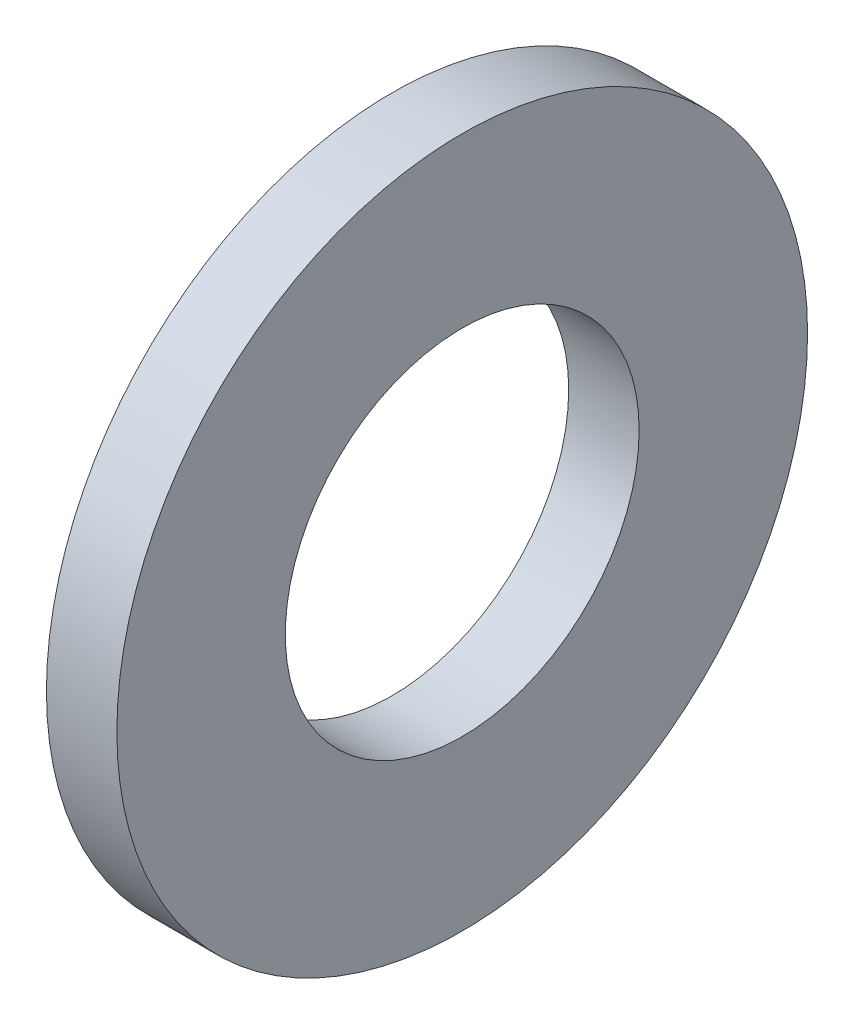
ISO-10303-21;
HEADER;
FILE_DESCRIPTION(('STEP AP214'),'2;1');
FILE_NAME('part.step','',(''),(''),'','','');
FILE_SCHEMA(('AUTOMOTIVE_DESIGN { 1 0 10303 214 1 1 1 1 }'));
ENDSEC;
DATA;
#1=APPLICATION_CONTEXT('core data for automotive mechanical design processes');
#2=APPLICATION_PROTOCOL_DEFINITION('international standard','automotive_design',2000,#1);
#3=PRODUCT_CONTEXT('',#1,'mechanical');
#4=PRODUCT('Part','Part','',(#3));
#5=PRODUCT_RELATED_PRODUCT_CATEGORY('part','',(#4));
#6=PRODUCT_DEFINITION_FORMATION('','',#4);
#7=PRODUCT_DEFINITION_CONTEXT('part definition',#1,'design');
#8=PRODUCT_DEFINITION('design','',#6,#7);
#9=PRODUCT_DEFINITION_SHAPE('','',#8);
#10=(LENGTH_UNIT() NAMED_UNIT(*) SI_UNIT(.MILLI.,.METRE.));
#11=(NAMED_UNIT(*) PLANE_ANGLE_UNIT() SI_UNIT($,.RADIAN.));
#12=(NAMED_UNIT(*) SI_UNIT($,.STERADIAN.) SOLID_ANGLE_UNIT());
#13=UNCERTAINTY_MEASURE_WITH_UNIT(LENGTH_MEASURE(1.E-05),#10,'distance_accuracy_value','');
#14=(GEOMETRIC_REPRESENTATION_CONTEXT(3) GLOBAL_UNCERTAINTY_ASSIGNED_CONTEXT((#13)) GLOBAL_UNIT_ASSIGNED_CONTEXT((#10,
#11,#12)) REPRESENTATION_CONTEXT('',''));
#15=CARTESIAN_POINT('',(0.,0.,0.));
#16=DIRECTION('',(0.,0.,1.));
#17=DIRECTION('',(1.,0.,0.));
#18=AXIS2_PLACEMENT_3D('',#15,#16,#17);
#19=CARTESIAN_POINT('',(1.2,0.,0.));
#20=DIRECTION('',(1.,0.,0.));
#21=DIRECTION('',(0.,0.,-1.));
#22=AXIS2_PLACEMENT_3D('',#19,#20,#21);
#23=PLANE('',#22);
#24=CARTESIAN_POINT('',(1.2,0.,0.));
#25=DIRECTION('',(1.,0.,0.));
#26=DIRECTION('',(0.,0.,-1.));
#27=AXIS2_PLACEMENT_3D('',#24,#25,#26);
#28=CIRCLE('',#27,5.885);
#29=CARTESIAN_POINT('',(1.2,0.,-5.885));
#30=VERTEX_POINT('',#29);
#31=EDGE_CURVE('E10',#30,#30,#28,.T.);
#32=ORIENTED_EDGE('',*,*,#31,.T.);
#33=EDGE_LOOP('',(#32));
#34=FACE_BOUND('',#33,.T.);
#35=CARTESIAN_POINT('',(1.2,0.,0.));
#36=DIRECTION('',(1.,0.,0.));
#37=DIRECTION('',(0.,0.,-1.));
#38=AXIS2_PLACEMENT_3D('',#35,#36,#37);
#39=CIRCLE('',#38,3.015);
#40=CARTESIAN_POINT('',(1.2,0.,-3.015));
#41=VERTEX_POINT('',#40);
#42=EDGE_CURVE('E41',#41,#41,#39,.T.);
#43=ORIENTED_EDGE('',*,*,#42,.F.);
#44=EDGE_LOOP('',(#43));
#45=FACE_BOUND('',#44,.T.);
#46=ADVANCED_FACE('F30',(#34,#45),#23,.T.);
#47=CARTESIAN_POINT('',(0.,0.,0.));
#48=DIRECTION('',(1.,0.,0.));
#49=DIRECTION('',(0.,0.,-1.));
#50=AXIS2_PLACEMENT_3D('',#47,#48,#49);
#51=PLANE('',#50);
#52=CARTESIAN_POINT('',(0.,0.,0.));
#53=DIRECTION('',(1.,0.,0.));
#54=DIRECTION('',(0.,0.,-1.));
#55=AXIS2_PLACEMENT_3D('',#52,#53,#54);
#56=CIRCLE('',#55,5.885);
#57=CARTESIAN_POINT('',(0.,0.,-5.885));
#58=VERTEX_POINT('',#57);
#59=EDGE_CURVE('E34',#58,#58,#56,.T.);
#60=ORIENTED_EDGE('',*,*,#59,.F.);
#61=EDGE_LOOP('',(#60));
#62=FACE_BOUND('',#61,.T.);
#63=CARTESIAN_POINT('',(0.,0.,0.));
#64=DIRECTION('',(1.,0.,0.));
#65=DIRECTION('',(0.,0.,-1.));
#66=AXIS2_PLACEMENT_3D('',#63,#64,#65);
#67=CIRCLE('',#66,3.015);
#68=CARTESIAN_POINT('',(0.,0.,-3.015));
#69=VERTEX_POINT('',#68);
#70=EDGE_CURVE('E43',#69,#69,#67,.T.);
#71=ORIENTED_EDGE('',*,*,#70,.T.);
#72=EDGE_LOOP('',(#71));
#73=FACE_BOUND('',#72,.T.);
#74=ADVANCED_FACE('F53',(#62,#73),#51,.F.);
#75=CARTESIAN_POINT('',(1.2,0.,0.));
#76=DIRECTION('',(-1.,0.,0.));
#77=DIRECTION('',(0.,0.,1.));
#78=AXIS2_PLACEMENT_3D('',#75,#76,#77);
#79=CYLINDRICAL_SURFACE('',#78,5.885);
#80=ORIENTED_EDGE('',*,*,#31,.F.);
#81=EDGE_LOOP('',(#80));
#82=FACE_BOUND('',#81,.T.);
#83=ORIENTED_EDGE('',*,*,#59,.T.);
#84=EDGE_LOOP('',(#83));
#85=FACE_BOUND('',#84,.T.);
#86=ADVANCED_FACE('F32',(#82,#85),#79,.T.);
#87=CARTESIAN_POINT('',(1.2,0.,0.));
#88=DIRECTION('',(-1.,0.,0.));
#89=DIRECTION('',(0.,0.,1.));
#90=AXIS2_PLACEMENT_3D('',#87,#88,#89);
#91=CYLINDRICAL_SURFACE('',#90,3.015);
#92=ORIENTED_EDGE('',*,*,#42,.T.);
#93=EDGE_LOOP('',(#92));
#94=FACE_BOUND('',#93,.T.);
#95=ORIENTED_EDGE('',*,*,#70,.F.);
#96=EDGE_LOOP('',(#95));
#97=FACE_BOUND('',#96,.T.);
#98=ADVANCED_FACE('F49',(#94,#97),#91,.F.);
#99=CLOSED_SHELL('',(#46,#74,#86,#98));
#100=MANIFOLD_SOLID_BREP('B2',#99);
#101=ADVANCED_BREP_SHAPE_REPRESENTATION('',(#18,#100),#14);
#102=SHAPE_DEFINITION_REPRESENTATION(#9,#101);
ENDSEC;
END-ISO-10303-21;
